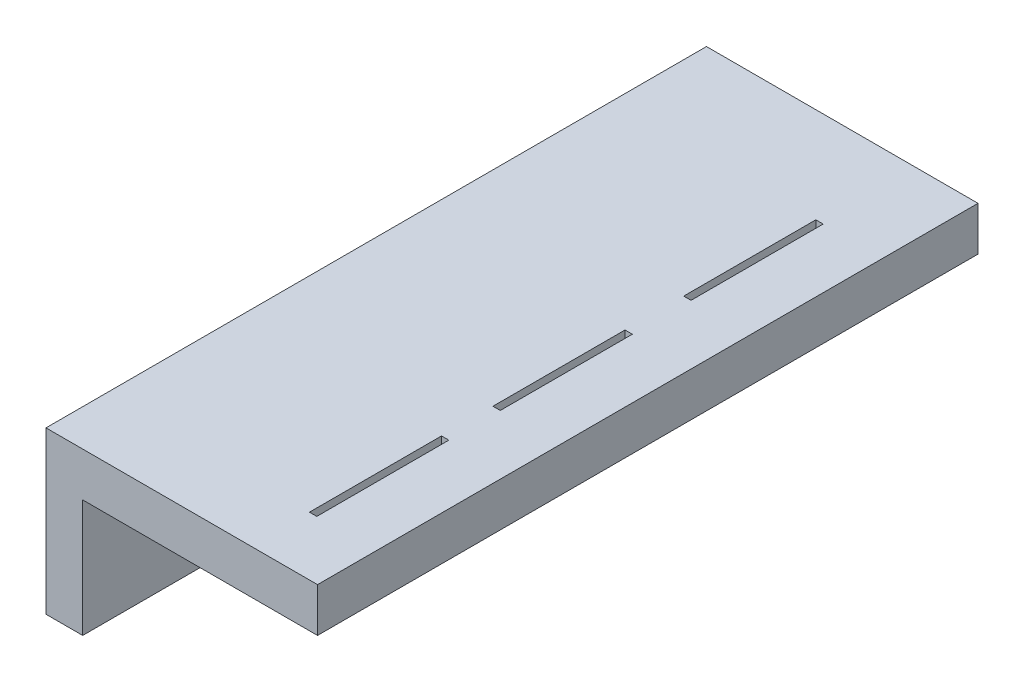
ISO-10303-21;
HEADER;
FILE_DESCRIPTION(('STEP AP214'),'2;1');
FILE_NAME('part.step','',(''),(''),'','','');
FILE_SCHEMA(('AUTOMOTIVE_DESIGN { 1 0 10303 214 1 1 1 1 }'));
ENDSEC;
DATA;
#1=APPLICATION_CONTEXT('core data for automotive mechanical design processes');
#2=APPLICATION_PROTOCOL_DEFINITION('international standard','automotive_design',2000,#1);
#3=PRODUCT_CONTEXT('',#1,'mechanical');
#4=PRODUCT('Part','Part','',(#3));
#5=PRODUCT_RELATED_PRODUCT_CATEGORY('part','',(#4));
#6=PRODUCT_DEFINITION_FORMATION('','',#4);
#7=PRODUCT_DEFINITION_CONTEXT('part definition',#1,'design');
#8=PRODUCT_DEFINITION('design','',#6,#7);
#9=PRODUCT_DEFINITION_SHAPE('','',#8);
#10=(LENGTH_UNIT() NAMED_UNIT(*) SI_UNIT(.MILLI.,.METRE.));
#11=(NAMED_UNIT(*) PLANE_ANGLE_UNIT() SI_UNIT($,.RADIAN.));
#12=(NAMED_UNIT(*) SI_UNIT($,.STERADIAN.) SOLID_ANGLE_UNIT());
#13=UNCERTAINTY_MEASURE_WITH_UNIT(LENGTH_MEASURE(1.E-05),#10,'distance_accuracy_value','');
#14=(GEOMETRIC_REPRESENTATION_CONTEXT(3) GLOBAL_UNCERTAINTY_ASSIGNED_CONTEXT((#13)) GLOBAL_UNIT_ASSIGNED_CONTEXT((#10,
#11,#12)) REPRESENTATION_CONTEXT('',''));
#15=CARTESIAN_POINT('',(0.,0.,0.));
#16=DIRECTION('',(0.,0.,1.));
#17=DIRECTION('',(1.,0.,0.));
#18=AXIS2_PLACEMENT_3D('',#15,#16,#17);
#19=CARTESIAN_POINT('',(0.,30.,0.));
#20=DIRECTION('',(0.,1.,0.));
#21=DIRECTION('',(0.,0.,1.));
#22=AXIS2_PLACEMENT_3D('',#19,#20,#21);
#23=PLANE('',#22);
#24=DIRECTION('',(-1.,0.,0.));
#25=VECTOR('',#24,1.);
#26=CARTESIAN_POINT('',(11.45,30.,-30.));
#27=LINE('',#26,#25);
#28=CARTESIAN_POINT('',(11.95,30.,-30.));
#29=VERTEX_POINT('',#28);
#30=CARTESIAN_POINT('',(11.45,30.,-30.));
#31=VERTEX_POINT('',#30);
#32=EDGE_CURVE('E231',#29,#31,#27,.T.);
#33=ORIENTED_EDGE('',*,*,#32,.T.);
#34=DIRECTION('',(0.,0.,1.));
#35=VECTOR('',#34,1.);
#36=CARTESIAN_POINT('',(11.45,30.,-30.));
#37=LINE('',#36,#35);
#38=CARTESIAN_POINT('',(11.45,30.,-21.));
#39=VERTEX_POINT('',#38);
#40=EDGE_CURVE('E221',#31,#39,#37,.T.);
#41=ORIENTED_EDGE('',*,*,#40,.T.);
#42=DIRECTION('',(1.,0.,0.));
#43=VECTOR('',#42,1.);
#44=CARTESIAN_POINT('',(11.45,30.,-21.));
#45=LINE('',#44,#43);
#46=CARTESIAN_POINT('',(11.95,30.,-21.));
#47=VERTEX_POINT('',#46);
#48=EDGE_CURVE('E224',#39,#47,#45,.T.);
#49=ORIENTED_EDGE('',*,*,#48,.T.);
#50=DIRECTION('',(0.,0.,-1.));
#51=VECTOR('',#50,1.);
#52=CARTESIAN_POINT('',(11.95,30.,-30.));
#53=LINE('',#52,#51);
#54=EDGE_CURVE('E228',#47,#29,#53,.T.);
#55=ORIENTED_EDGE('',*,*,#54,.T.);
#56=EDGE_LOOP('',(#33,#41,#49,#55));
#57=FACE_BOUND('',#56,.T.);
#58=DIRECTION('',(-1.,0.,0.));
#59=VECTOR('',#58,1.);
#60=CARTESIAN_POINT('',(11.45,30.,-42.5));
#61=LINE('',#60,#59);
#62=CARTESIAN_POINT('',(11.95,30.,-42.5));
#63=VERTEX_POINT('',#62);
#64=CARTESIAN_POINT('',(11.45,30.,-42.5));
#65=VERTEX_POINT('',#64);
#66=EDGE_CURVE('E263',#63,#65,#61,.T.);
#67=ORIENTED_EDGE('',*,*,#66,.T.);
#68=DIRECTION('',(0.,0.,1.));
#69=VECTOR('',#68,1.);
#70=CARTESIAN_POINT('',(11.45,30.,-42.5));
#71=LINE('',#70,#69);
#72=CARTESIAN_POINT('',(11.45,30.,-33.5));
#73=VERTEX_POINT('',#72);
#74=EDGE_CURVE('E253',#65,#73,#71,.T.);
#75=ORIENTED_EDGE('',*,*,#74,.T.);
#76=DIRECTION('',(1.,0.,0.));
#77=VECTOR('',#76,1.);
#78=CARTESIAN_POINT('',(11.45,30.,-33.5));
#79=LINE('',#78,#77);
#80=CARTESIAN_POINT('',(11.95,30.,-33.5));
#81=VERTEX_POINT('',#80);
#82=EDGE_CURVE('E256',#73,#81,#79,.T.);
#83=ORIENTED_EDGE('',*,*,#82,.T.);
#84=DIRECTION('',(0.,0.,-1.));
#85=VECTOR('',#84,1.);
#86=CARTESIAN_POINT('',(11.95,30.,-42.5));
#87=LINE('',#86,#85);
#88=EDGE_CURVE('E260',#81,#63,#87,.T.);
#89=ORIENTED_EDGE('',*,*,#88,.T.);
#90=EDGE_LOOP('',(#67,#75,#83,#89));
#91=FACE_BOUND('',#90,.T.);
#92=DIRECTION('',(-1.,0.,0.));
#93=VECTOR('',#92,1.);
#94=CARTESIAN_POINT('',(11.45,30.,-55.5));
#95=LINE('',#94,#93);
#96=CARTESIAN_POINT('',(11.95,30.,-55.5));
#97=VERTEX_POINT('',#96);
#98=CARTESIAN_POINT('',(11.45,30.,-55.5));
#99=VERTEX_POINT('',#98);
#100=EDGE_CURVE('E295',#97,#99,#95,.T.);
#101=ORIENTED_EDGE('',*,*,#100,.T.);
#102=DIRECTION('',(0.,0.,1.));
#103=VECTOR('',#102,1.);
#104=CARTESIAN_POINT('',(11.45,30.,-55.5));
#105=LINE('',#104,#103);
#106=CARTESIAN_POINT('',(11.45,30.,-46.5));
#107=VERTEX_POINT('',#106);
#108=EDGE_CURVE('E285',#99,#107,#105,.T.);
#109=ORIENTED_EDGE('',*,*,#108,.T.);
#110=DIRECTION('',(1.,0.,0.));
#111=VECTOR('',#110,1.);
#112=CARTESIAN_POINT('',(11.45,30.,-46.5));
#113=LINE('',#112,#111);
#114=CARTESIAN_POINT('',(11.95,30.,-46.5));
#115=VERTEX_POINT('',#114);
#116=EDGE_CURVE('E288',#107,#115,#113,.T.);
#117=ORIENTED_EDGE('',*,*,#116,.T.);
#118=DIRECTION('',(0.,0.,-1.));
#119=VECTOR('',#118,1.);
#120=CARTESIAN_POINT('',(11.95,30.,-55.5));
#121=LINE('',#120,#119);
#122=EDGE_CURVE('E292',#115,#97,#121,.T.);
#123=ORIENTED_EDGE('',*,*,#122,.T.);
#124=EDGE_LOOP('',(#101,#109,#117,#123));
#125=FACE_BOUND('',#124,.T.);
#126=DIRECTION('',(0.,0.,1.));
#127=VECTOR('',#126,1.);
#128=CARTESIAN_POINT('',(0.,30.,-17.));
#129=LINE('',#128,#127);
#130=CARTESIAN_POINT('',(0.,30.,-62.));
#131=VERTEX_POINT('',#130);
#132=CARTESIAN_POINT('',(0.,30.,-17.));
#133=VERTEX_POINT('',#132);
#134=EDGE_CURVE('E54',#131,#133,#129,.T.);
#135=ORIENTED_EDGE('',*,*,#134,.F.);
#136=DIRECTION('',(-1.,0.,0.));
#137=VECTOR('',#136,1.);
#138=CARTESIAN_POINT('',(70.4,30.,-62.));
#139=LINE('',#138,#137);
#140=CARTESIAN_POINT('',(16.,30.,-62.));
#141=VERTEX_POINT('',#140);
#142=EDGE_CURVE('E317',#141,#131,#139,.T.);
#143=ORIENTED_EDGE('',*,*,#142,.F.);
#144=DIRECTION('',(0.,0.,1.));
#145=VECTOR('',#144,1.);
#146=CARTESIAN_POINT('',(16.,30.,-62.));
#147=LINE('',#146,#145);
#148=CARTESIAN_POINT('',(16.,30.,-17.));
#149=VERTEX_POINT('',#148);
#150=EDGE_CURVE('E212',#141,#149,#147,.T.);
#151=ORIENTED_EDGE('',*,*,#150,.T.);
#152=DIRECTION('',(1.,0.,0.));
#153=VECTOR('',#152,1.);
#154=CARTESIAN_POINT('',(0.,30.,-17.));
#155=LINE('',#154,#153);
#156=EDGE_CURVE('E204',#133,#149,#155,.T.);
#157=ORIENTED_EDGE('',*,*,#156,.F.);
#158=EDGE_LOOP('',(#135,#143,#151,#157));
#159=FACE_BOUND('',#158,.T.);
#160=ADVANCED_FACE('F37',(#57,#91,#125,#159),#23,.F.);
#161=CARTESIAN_POINT('',(0.,0.,-62.));
#162=DIRECTION('',(0.,0.,-1.));
#163=DIRECTION('',(-1.,0.,0.));
#164=AXIS2_PLACEMENT_3D('',#161,#162,#163);
#165=PLANE('',#164);
#166=ORIENTED_EDGE('',*,*,#142,.T.);
#167=DIRECTION('',(0.,1.,0.));
#168=VECTOR('',#167,1.);
#169=CARTESIAN_POINT('',(0.,22.,-62.));
#170=LINE('',#169,#168);
#171=CARTESIAN_POINT('',(0.,22.,-62.));
#172=VERTEX_POINT('',#171);
#173=EDGE_CURVE('E180',#172,#131,#170,.T.);
#174=ORIENTED_EDGE('',*,*,#173,.F.);
#175=DIRECTION('',(1.,0.,0.));
#176=VECTOR('',#175,1.);
#177=CARTESIAN_POINT('',(-2.5,22.,-62.));
#178=LINE('',#177,#176);
#179=CARTESIAN_POINT('',(-2.5,22.,-62.));
#180=VERTEX_POINT('',#179);
#181=EDGE_CURVE('E178',#180,#172,#178,.T.);
#182=ORIENTED_EDGE('',*,*,#181,.F.);
#183=DIRECTION('',(0.,-1.,0.));
#184=VECTOR('',#183,1.);
#185=CARTESIAN_POINT('',(-2.5,33.,-62.));
#186=LINE('',#185,#184);
#187=CARTESIAN_POINT('',(-2.5,33.,-62.));
#188=VERTEX_POINT('',#187);
#189=EDGE_CURVE('E165',#188,#180,#186,.T.);
#190=ORIENTED_EDGE('',*,*,#189,.F.);
#191=DIRECTION('',(-1.,0.,0.));
#192=VECTOR('',#191,1.);
#193=CARTESIAN_POINT('',(70.4,33.,-62.));
#194=LINE('',#193,#192);
#195=CARTESIAN_POINT('',(16.,33.,-62.));
#196=VERTEX_POINT('',#195);
#197=EDGE_CURVE('E11',#196,#188,#194,.T.);
#198=ORIENTED_EDGE('',*,*,#197,.F.);
#199=DIRECTION('',(0.,1.,0.));
#200=VECTOR('',#199,1.);
#201=CARTESIAN_POINT('',(16.,30.,-62.));
#202=LINE('',#201,#200);
#203=EDGE_CURVE('E62',#141,#196,#202,.T.);
#204=ORIENTED_EDGE('',*,*,#203,.F.);
#205=EDGE_LOOP('',(#166,#174,#182,#190,#198,#204));
#206=FACE_BOUND('',#205,.T.);
#207=ADVANCED_FACE('F39',(#206),#165,.T.);
#208=CARTESIAN_POINT('',(0.,30.,-17.));
#209=DIRECTION('',(0.,0.,-1.));
#210=DIRECTION('',(-1.,0.,0.));
#211=AXIS2_PLACEMENT_3D('',#208,#209,#210);
#212=PLANE('',#211);
#213=DIRECTION('',(1.,0.,0.));
#214=VECTOR('',#213,1.);
#215=CARTESIAN_POINT('',(0.,33.,-17.));
#216=LINE('',#215,#214);
#217=CARTESIAN_POINT('',(-2.5,33.,-17.));
#218=VERTEX_POINT('',#217);
#219=CARTESIAN_POINT('',(16.,33.,-17.));
#220=VERTEX_POINT('',#219);
#221=EDGE_CURVE('E46',#218,#220,#216,.T.);
#222=ORIENTED_EDGE('',*,*,#221,.F.);
#223=DIRECTION('',(0.,1.,0.));
#224=VECTOR('',#223,1.);
#225=CARTESIAN_POINT('',(-2.5,33.,-17.));
#226=LINE('',#225,#224);
#227=CARTESIAN_POINT('',(-2.5,22.,-17.));
#228=VERTEX_POINT('',#227);
#229=EDGE_CURVE('E200',#228,#218,#226,.T.);
#230=ORIENTED_EDGE('',*,*,#229,.F.);
#231=DIRECTION('',(-1.,0.,0.));
#232=VECTOR('',#231,1.);
#233=CARTESIAN_POINT('',(-2.5,22.,-17.));
#234=LINE('',#233,#232);
#235=CARTESIAN_POINT('',(0.,22.,-17.));
#236=VERTEX_POINT('',#235);
#237=EDGE_CURVE('E188',#236,#228,#234,.T.);
#238=ORIENTED_EDGE('',*,*,#237,.F.);
#239=DIRECTION('',(0.,1.,0.));
#240=VECTOR('',#239,1.);
#241=CARTESIAN_POINT('',(0.,22.,-17.));
#242=LINE('',#241,#240);
#243=EDGE_CURVE('E197',#236,#133,#242,.T.);
#244=ORIENTED_EDGE('',*,*,#243,.T.);
#245=ORIENTED_EDGE('',*,*,#156,.T.);
#246=DIRECTION('',(0.,1.,0.));
#247=VECTOR('',#246,1.);
#248=CARTESIAN_POINT('',(16.,30.,-17.));
#249=LINE('',#248,#247);
#250=EDGE_CURVE('E215',#149,#220,#249,.T.);
#251=ORIENTED_EDGE('',*,*,#250,.T.);
#252=EDGE_LOOP('',(#222,#230,#238,#244,#245,#251));
#253=FACE_BOUND('',#252,.T.);
#254=ADVANCED_FACE('F323',(#253),#212,.F.);
#255=CARTESIAN_POINT('',(0.,33.,0.));
#256=DIRECTION('',(0.,1.,0.));
#257=DIRECTION('',(0.,0.,1.));
#258=AXIS2_PLACEMENT_3D('',#255,#256,#257);
#259=PLANE('',#258);
#260=DIRECTION('',(0.,0.,1.));
#261=VECTOR('',#260,1.);
#262=CARTESIAN_POINT('',(16.,33.,-62.));
#263=LINE('',#262,#261);
#264=EDGE_CURVE('E175',#196,#220,#263,.T.);
#265=ORIENTED_EDGE('',*,*,#264,.F.);
#266=ORIENTED_EDGE('',*,*,#197,.T.);
#267=DIRECTION('',(0.,0.,-1.));
#268=VECTOR('',#267,1.);
#269=CARTESIAN_POINT('',(-2.5,33.,-17.));
#270=LINE('',#269,#268);
#271=EDGE_CURVE('E172',#218,#188,#270,.T.);
#272=ORIENTED_EDGE('',*,*,#271,.F.);
#273=ORIENTED_EDGE('',*,*,#221,.T.);
#274=EDGE_LOOP('',(#265,#266,#272,#273));
#275=FACE_BOUND('',#274,.T.);
#276=DIRECTION('',(0.,0.,1.));
#277=VECTOR('',#276,1.);
#278=CARTESIAN_POINT('',(11.45,33.,-55.5));
#279=LINE('',#278,#277);
#280=CARTESIAN_POINT('',(11.45,33.,-55.5));
#281=VERTEX_POINT('',#280);
#282=CARTESIAN_POINT('',(11.45,33.,-46.5));
#283=VERTEX_POINT('',#282);
#284=EDGE_CURVE('E278',#281,#283,#279,.T.);
#285=ORIENTED_EDGE('',*,*,#284,.F.);
#286=DIRECTION('',(-1.,0.,0.));
#287=VECTOR('',#286,1.);
#288=CARTESIAN_POINT('',(11.45,33.,-55.5));
#289=LINE('',#288,#287);
#290=CARTESIAN_POINT('',(11.95,33.,-55.5));
#291=VERTEX_POINT('',#290);
#292=EDGE_CURVE('E289',#291,#281,#289,.T.);
#293=ORIENTED_EDGE('',*,*,#292,.F.);
#294=DIRECTION('',(0.,0.,-1.));
#295=VECTOR('',#294,1.);
#296=CARTESIAN_POINT('',(11.95,33.,-55.5));
#297=LINE('',#296,#295);
#298=CARTESIAN_POINT('',(11.95,33.,-46.5));
#299=VERTEX_POINT('',#298);
#300=EDGE_CURVE('E303',#299,#291,#297,.T.);
#301=ORIENTED_EDGE('',*,*,#300,.F.);
#302=DIRECTION('',(1.,0.,0.));
#303=VECTOR('',#302,1.);
#304=CARTESIAN_POINT('',(11.45,33.,-46.5));
#305=LINE('',#304,#303);
#306=EDGE_CURVE('E300',#283,#299,#305,.T.);
#307=ORIENTED_EDGE('',*,*,#306,.F.);
#308=EDGE_LOOP('',(#285,#293,#301,#307));
#309=FACE_BOUND('',#308,.T.);
#310=DIRECTION('',(0.,0.,1.));
#311=VECTOR('',#310,1.);
#312=CARTESIAN_POINT('',(11.45,33.,-42.5));
#313=LINE('',#312,#311);
#314=CARTESIAN_POINT('',(11.45,33.,-42.5));
#315=VERTEX_POINT('',#314);
#316=CARTESIAN_POINT('',(11.45,33.,-33.5));
#317=VERTEX_POINT('',#316);
#318=EDGE_CURVE('E246',#315,#317,#313,.T.);
#319=ORIENTED_EDGE('',*,*,#318,.F.);
#320=DIRECTION('',(-1.,0.,0.));
#321=VECTOR('',#320,1.);
#322=CARTESIAN_POINT('',(11.45,33.,-42.5));
#323=LINE('',#322,#321);
#324=CARTESIAN_POINT('',(11.95,33.,-42.5));
#325=VERTEX_POINT('',#324);
#326=EDGE_CURVE('E257',#325,#315,#323,.T.);
#327=ORIENTED_EDGE('',*,*,#326,.F.);
#328=DIRECTION('',(0.,0.,-1.));
#329=VECTOR('',#328,1.);
#330=CARTESIAN_POINT('',(11.95,33.,-42.5));
#331=LINE('',#330,#329);
#332=CARTESIAN_POINT('',(11.95,33.,-33.5));
#333=VERTEX_POINT('',#332);
#334=EDGE_CURVE('E271',#333,#325,#331,.T.);
#335=ORIENTED_EDGE('',*,*,#334,.F.);
#336=DIRECTION('',(1.,0.,0.));
#337=VECTOR('',#336,1.);
#338=CARTESIAN_POINT('',(11.45,33.,-33.5));
#339=LINE('',#338,#337);
#340=EDGE_CURVE('E268',#317,#333,#339,.T.);
#341=ORIENTED_EDGE('',*,*,#340,.F.);
#342=EDGE_LOOP('',(#319,#327,#335,#341));
#343=FACE_BOUND('',#342,.T.);
#344=DIRECTION('',(0.,0.,1.));
#345=VECTOR('',#344,1.);
#346=CARTESIAN_POINT('',(11.45,33.,-30.));
#347=LINE('',#346,#345);
#348=CARTESIAN_POINT('',(11.45,33.,-30.));
#349=VERTEX_POINT('',#348);
#350=CARTESIAN_POINT('',(11.45,33.,-21.));
#351=VERTEX_POINT('',#350);
#352=EDGE_CURVE('E218',#349,#351,#347,.T.);
#353=ORIENTED_EDGE('',*,*,#352,.F.);
#354=DIRECTION('',(-1.,0.,0.));
#355=VECTOR('',#354,1.);
#356=CARTESIAN_POINT('',(11.45,33.,-30.));
#357=LINE('',#356,#355);
#358=CARTESIAN_POINT('',(11.95,33.,-30.));
#359=VERTEX_POINT('',#358);
#360=EDGE_CURVE('E225',#359,#349,#357,.T.);
#361=ORIENTED_EDGE('',*,*,#360,.F.);
#362=DIRECTION('',(0.,0.,-1.));
#363=VECTOR('',#362,1.);
#364=CARTESIAN_POINT('',(11.95,33.,-30.));
#365=LINE('',#364,#363);
#366=CARTESIAN_POINT('',(11.95,33.,-21.));
#367=VERTEX_POINT('',#366);
#368=EDGE_CURVE('E239',#367,#359,#365,.T.);
#369=ORIENTED_EDGE('',*,*,#368,.F.);
#370=DIRECTION('',(1.,0.,0.));
#371=VECTOR('',#370,1.);
#372=CARTESIAN_POINT('',(11.45,33.,-21.));
#373=LINE('',#372,#371);
#374=EDGE_CURVE('E236',#351,#367,#373,.T.);
#375=ORIENTED_EDGE('',*,*,#374,.F.);
#376=EDGE_LOOP('',(#353,#361,#369,#375));
#377=FACE_BOUND('',#376,.T.);
#378=ADVANCED_FACE('F334',(#275,#309,#343,#377),#259,.T.);
#379=CARTESIAN_POINT('',(11.45,30.,-55.5));
#380=DIRECTION('',(-1.,0.,0.));
#381=DIRECTION('',(0.,0.,1.));
#382=AXIS2_PLACEMENT_3D('',#379,#380,#381);
#383=PLANE('',#382);
#384=ORIENTED_EDGE('',*,*,#284,.T.);
#385=DIRECTION('',(0.,1.,0.));
#386=VECTOR('',#385,1.);
#387=CARTESIAN_POINT('',(11.45,30.,-46.5));
#388=LINE('',#387,#386);
#389=EDGE_CURVE('E298',#107,#283,#388,.T.);
#390=ORIENTED_EDGE('',*,*,#389,.F.);
#391=ORIENTED_EDGE('',*,*,#108,.F.);
#392=DIRECTION('',(0.,1.,0.));
#393=VECTOR('',#392,1.);
#394=CARTESIAN_POINT('',(11.45,30.,-55.5));
#395=LINE('',#394,#393);
#396=EDGE_CURVE('E308',#99,#281,#395,.T.);
#397=ORIENTED_EDGE('',*,*,#396,.T.);
#398=EDGE_LOOP('',(#384,#390,#391,#397));
#399=FACE_BOUND('',#398,.T.);
#400=ADVANCED_FACE('F340',(#399),#383,.F.);
#401=CARTESIAN_POINT('',(11.45,30.,-55.5));
#402=DIRECTION('',(0.,0.,-1.));
#403=DIRECTION('',(-1.,0.,0.));
#404=AXIS2_PLACEMENT_3D('',#401,#402,#403);
#405=PLANE('',#404);
#406=ORIENTED_EDGE('',*,*,#292,.T.);
#407=ORIENTED_EDGE('',*,*,#396,.F.);
#408=ORIENTED_EDGE('',*,*,#100,.F.);
#409=DIRECTION('',(0.,1.,0.));
#410=VECTOR('',#409,1.);
#411=CARTESIAN_POINT('',(11.95,30.,-55.5));
#412=LINE('',#411,#410);
#413=EDGE_CURVE('E310',#97,#291,#412,.T.);
#414=ORIENTED_EDGE('',*,*,#413,.T.);
#415=EDGE_LOOP('',(#406,#407,#408,#414));
#416=FACE_BOUND('',#415,.T.);
#417=ADVANCED_FACE('F345',(#416),#405,.F.);
#418=CARTESIAN_POINT('',(11.95,30.,-55.5));
#419=DIRECTION('',(1.,0.,0.));
#420=DIRECTION('',(0.,0.,-1.));
#421=AXIS2_PLACEMENT_3D('',#418,#419,#420);
#422=PLANE('',#421);
#423=ORIENTED_EDGE('',*,*,#300,.T.);
#424=ORIENTED_EDGE('',*,*,#413,.F.);
#425=ORIENTED_EDGE('',*,*,#122,.F.);
#426=DIRECTION('',(0.,1.,0.));
#427=VECTOR('',#426,1.);
#428=CARTESIAN_POINT('',(11.95,30.,-46.5));
#429=LINE('',#428,#427);
#430=EDGE_CURVE('E312',#115,#299,#429,.T.);
#431=ORIENTED_EDGE('',*,*,#430,.T.);
#432=EDGE_LOOP('',(#423,#424,#425,#431));
#433=FACE_BOUND('',#432,.T.);
#434=ADVANCED_FACE('F403',(#433),#422,.F.);
#435=CARTESIAN_POINT('',(11.45,30.,-46.5));
#436=DIRECTION('',(0.,0.,1.));
#437=DIRECTION('',(1.,0.,0.));
#438=AXIS2_PLACEMENT_3D('',#435,#436,#437);
#439=PLANE('',#438);
#440=ORIENTED_EDGE('',*,*,#306,.T.);
#441=ORIENTED_EDGE('',*,*,#430,.F.);
#442=ORIENTED_EDGE('',*,*,#116,.F.);
#443=ORIENTED_EDGE('',*,*,#389,.T.);
#444=EDGE_LOOP('',(#440,#441,#442,#443));
#445=FACE_BOUND('',#444,.T.);
#446=ADVANCED_FACE('F399',(#445),#439,.F.);
#447=CARTESIAN_POINT('',(11.45,30.,-42.5));
#448=DIRECTION('',(-1.,0.,0.));
#449=DIRECTION('',(0.,0.,1.));
#450=AXIS2_PLACEMENT_3D('',#447,#448,#449);
#451=PLANE('',#450);
#452=ORIENTED_EDGE('',*,*,#318,.T.);
#453=DIRECTION('',(0.,1.,0.));
#454=VECTOR('',#453,1.);
#455=CARTESIAN_POINT('',(11.45,30.,-33.5));
#456=LINE('',#455,#454);
#457=EDGE_CURVE('E266',#73,#317,#456,.T.);
#458=ORIENTED_EDGE('',*,*,#457,.F.);
#459=ORIENTED_EDGE('',*,*,#74,.F.);
#460=DIRECTION('',(0.,1.,0.));
#461=VECTOR('',#460,1.);
#462=CARTESIAN_POINT('',(11.45,30.,-42.5));
#463=LINE('',#462,#461);
#464=EDGE_CURVE('E276',#65,#315,#463,.T.);
#465=ORIENTED_EDGE('',*,*,#464,.T.);
#466=EDGE_LOOP('',(#452,#458,#459,#465));
#467=FACE_BOUND('',#466,.T.);
#468=ADVANCED_FACE('F389',(#467),#451,.F.);
#469=CARTESIAN_POINT('',(11.45,30.,-42.5));
#470=DIRECTION('',(0.,0.,-1.));
#471=DIRECTION('',(-1.,0.,0.));
#472=AXIS2_PLACEMENT_3D('',#469,#470,#471);
#473=PLANE('',#472);
#474=ORIENTED_EDGE('',*,*,#326,.T.);
#475=ORIENTED_EDGE('',*,*,#464,.F.);
#476=ORIENTED_EDGE('',*,*,#66,.F.);
#477=DIRECTION('',(0.,1.,0.));
#478=VECTOR('',#477,1.);
#479=CARTESIAN_POINT('',(11.95,30.,-42.5));
#480=LINE('',#479,#478);
#481=EDGE_CURVE('E279',#63,#325,#480,.T.);
#482=ORIENTED_EDGE('',*,*,#481,.T.);
#483=EDGE_LOOP('',(#474,#475,#476,#482));
#484=FACE_BOUND('',#483,.T.);
#485=ADVANCED_FACE('F385',(#484),#473,.F.);
#486=CARTESIAN_POINT('',(11.95,30.,-42.5));
#487=DIRECTION('',(1.,0.,0.));
#488=DIRECTION('',(0.,0.,-1.));
#489=AXIS2_PLACEMENT_3D('',#486,#487,#488);
#490=PLANE('',#489);
#491=ORIENTED_EDGE('',*,*,#334,.T.);
#492=ORIENTED_EDGE('',*,*,#481,.F.);
#493=ORIENTED_EDGE('',*,*,#88,.F.);
#494=DIRECTION('',(0.,1.,0.));
#495=VECTOR('',#494,1.);
#496=CARTESIAN_POINT('',(11.95,30.,-33.5));
#497=LINE('',#496,#495);
#498=EDGE_CURVE('E281',#81,#333,#497,.T.);
#499=ORIENTED_EDGE('',*,*,#498,.T.);
#500=EDGE_LOOP('',(#491,#492,#493,#499));
#501=FACE_BOUND('',#500,.T.);
#502=ADVANCED_FACE('F388',(#501),#490,.F.);
#503=CARTESIAN_POINT('',(11.45,30.,-33.5));
#504=DIRECTION('',(0.,0.,1.));
#505=DIRECTION('',(1.,0.,0.));
#506=AXIS2_PLACEMENT_3D('',#503,#504,#505);
#507=PLANE('',#506);
#508=ORIENTED_EDGE('',*,*,#340,.T.);
#509=ORIENTED_EDGE('',*,*,#498,.F.);
#510=ORIENTED_EDGE('',*,*,#82,.F.);
#511=ORIENTED_EDGE('',*,*,#457,.T.);
#512=EDGE_LOOP('',(#508,#509,#510,#511));
#513=FACE_BOUND('',#512,.T.);
#514=ADVANCED_FACE('F384',(#513),#507,.F.);
#515=CARTESIAN_POINT('',(11.45,30.,-30.));
#516=DIRECTION('',(-1.,0.,0.));
#517=DIRECTION('',(0.,0.,1.));
#518=AXIS2_PLACEMENT_3D('',#515,#516,#517);
#519=PLANE('',#518);
#520=ORIENTED_EDGE('',*,*,#352,.T.);
#521=DIRECTION('',(0.,1.,0.));
#522=VECTOR('',#521,1.);
#523=CARTESIAN_POINT('',(11.45,30.,-21.));
#524=LINE('',#523,#522);
#525=EDGE_CURVE('E234',#39,#351,#524,.T.);
#526=ORIENTED_EDGE('',*,*,#525,.F.);
#527=ORIENTED_EDGE('',*,*,#40,.F.);
#528=DIRECTION('',(0.,1.,0.));
#529=VECTOR('',#528,1.);
#530=CARTESIAN_POINT('',(11.45,30.,-30.));
#531=LINE('',#530,#529);
#532=EDGE_CURVE('E244',#31,#349,#531,.T.);
#533=ORIENTED_EDGE('',*,*,#532,.T.);
#534=EDGE_LOOP('',(#520,#526,#527,#533));
#535=FACE_BOUND('',#534,.T.);
#536=ADVANCED_FACE('F361',(#535),#519,.F.);
#537=CARTESIAN_POINT('',(11.45,30.,-30.));
#538=DIRECTION('',(0.,0.,-1.));
#539=DIRECTION('',(-1.,0.,0.));
#540=AXIS2_PLACEMENT_3D('',#537,#538,#539);
#541=PLANE('',#540);
#542=ORIENTED_EDGE('',*,*,#360,.T.);
#543=ORIENTED_EDGE('',*,*,#532,.F.);
#544=ORIENTED_EDGE('',*,*,#32,.F.);
#545=DIRECTION('',(0.,1.,0.));
#546=VECTOR('',#545,1.);
#547=CARTESIAN_POINT('',(11.95,30.,-30.));
#548=LINE('',#547,#546);
#549=EDGE_CURVE('E247',#29,#359,#548,.T.);
#550=ORIENTED_EDGE('',*,*,#549,.T.);
#551=EDGE_LOOP('',(#542,#543,#544,#550));
#552=FACE_BOUND('',#551,.T.);
#553=ADVANCED_FACE('F369',(#552),#541,.F.);
#554=CARTESIAN_POINT('',(11.95,30.,-30.));
#555=DIRECTION('',(1.,0.,0.));
#556=DIRECTION('',(0.,0.,-1.));
#557=AXIS2_PLACEMENT_3D('',#554,#555,#556);
#558=PLANE('',#557);
#559=ORIENTED_EDGE('',*,*,#368,.T.);
#560=ORIENTED_EDGE('',*,*,#549,.F.);
#561=ORIENTED_EDGE('',*,*,#54,.F.);
#562=DIRECTION('',(0.,1.,0.));
#563=VECTOR('',#562,1.);
#564=CARTESIAN_POINT('',(11.95,30.,-21.));
#565=LINE('',#564,#563);
#566=EDGE_CURVE('E249',#47,#367,#565,.T.);
#567=ORIENTED_EDGE('',*,*,#566,.T.);
#568=EDGE_LOOP('',(#559,#560,#561,#567));
#569=FACE_BOUND('',#568,.T.);
#570=ADVANCED_FACE('F371',(#569),#558,.F.);
#571=CARTESIAN_POINT('',(11.45,30.,-21.));
#572=DIRECTION('',(0.,0.,1.));
#573=DIRECTION('',(1.,0.,0.));
#574=AXIS2_PLACEMENT_3D('',#571,#572,#573);
#575=PLANE('',#574);
#576=ORIENTED_EDGE('',*,*,#374,.T.);
#577=ORIENTED_EDGE('',*,*,#566,.F.);
#578=ORIENTED_EDGE('',*,*,#48,.F.);
#579=ORIENTED_EDGE('',*,*,#525,.T.);
#580=EDGE_LOOP('',(#576,#577,#578,#579));
#581=FACE_BOUND('',#580,.T.);
#582=ADVANCED_FACE('F365',(#581),#575,.F.);
#583=CARTESIAN_POINT('',(16.,30.,-62.));
#584=DIRECTION('',(-1.,0.,0.));
#585=DIRECTION('',(0.,0.,1.));
#586=AXIS2_PLACEMENT_3D('',#583,#584,#585);
#587=PLANE('',#586);
#588=ORIENTED_EDGE('',*,*,#264,.T.);
#589=ORIENTED_EDGE('',*,*,#250,.F.);
#590=ORIENTED_EDGE('',*,*,#150,.F.);
#591=ORIENTED_EDGE('',*,*,#203,.T.);
#592=EDGE_LOOP('',(#588,#589,#590,#591));
#593=FACE_BOUND('',#592,.T.);
#594=ADVANCED_FACE('F325',(#593),#587,.F.);
#595=CARTESIAN_POINT('',(-2.5,0.,0.));
#596=DIRECTION('',(1.,0.,0.));
#597=DIRECTION('',(0.,0.,-1.));
#598=AXIS2_PLACEMENT_3D('',#595,#596,#597);
#599=PLANE('',#598);
#600=CARTESIAN_POINT('',(-2.5,26.,-52.));
#601=DIRECTION('',(1.,0.,0.));
#602=DIRECTION('',(0.,0.,-1.));
#603=AXIS2_PLACEMENT_3D('',#600,#601,#602);
#604=CIRCLE('',#603,1.8);
#605=CARTESIAN_POINT('',(-2.5,26.,-53.8));
#606=VERTEX_POINT('',#605);
#607=EDGE_CURVE('E538',#606,#606,#604,.T.);
#608=ORIENTED_EDGE('',*,*,#607,.T.);
#609=EDGE_LOOP('',(#608));
#610=FACE_BOUND('',#609,.T.);
#611=CARTESIAN_POINT('',(-2.5,26.,-27.));
#612=DIRECTION('',(1.,0.,0.));
#613=DIRECTION('',(0.,0.,-1.));
#614=AXIS2_PLACEMENT_3D('',#611,#612,#613);
#615=CIRCLE('',#614,1.8);
#616=CARTESIAN_POINT('',(-2.5,26.,-28.8));
#617=VERTEX_POINT('',#616);
#618=EDGE_CURVE('E190',#617,#617,#615,.T.);
#619=ORIENTED_EDGE('',*,*,#618,.T.);
#620=EDGE_LOOP('',(#619));
#621=FACE_BOUND('',#620,.T.);
#622=ORIENTED_EDGE('',*,*,#229,.T.);
#623=ORIENTED_EDGE('',*,*,#271,.T.);
#624=ORIENTED_EDGE('',*,*,#189,.T.);
#625=DIRECTION('',(0.,0.,-1.));
#626=VECTOR('',#625,1.);
#627=CARTESIAN_POINT('',(-2.5,22.,-17.));
#628=LINE('',#627,#626);
#629=EDGE_CURVE('E170',#228,#180,#628,.T.);
#630=ORIENTED_EDGE('',*,*,#629,.F.);
#631=EDGE_LOOP('',(#622,#623,#624,#630));
#632=FACE_BOUND('',#631,.T.);
#633=ADVANCED_FACE('F168',(#610,#621,#632),#599,.F.);
#634=CARTESIAN_POINT('',(0.,22.,-17.));
#635=DIRECTION('',(-1.,0.,0.));
#636=DIRECTION('',(0.,0.,1.));
#637=AXIS2_PLACEMENT_3D('',#634,#635,#636);
#638=PLANE('',#637);
#639=CARTESIAN_POINT('',(0.,26.,-52.));
#640=DIRECTION('',(1.,0.,0.));
#641=DIRECTION('',(0.,0.,-1.));
#642=AXIS2_PLACEMENT_3D('',#639,#640,#641);
#643=CIRCLE('',#642,1.8);
#644=CARTESIAN_POINT('',(0.,26.,-53.8));
#645=VERTEX_POINT('',#644);
#646=EDGE_CURVE('E535',#645,#645,#643,.T.);
#647=ORIENTED_EDGE('',*,*,#646,.F.);
#648=EDGE_LOOP('',(#647));
#649=FACE_BOUND('',#648,.T.);
#650=CARTESIAN_POINT('',(0.,26.,-27.));
#651=DIRECTION('',(1.,0.,0.));
#652=DIRECTION('',(0.,0.,-1.));
#653=AXIS2_PLACEMENT_3D('',#650,#651,#652);
#654=CIRCLE('',#653,1.8);
#655=CARTESIAN_POINT('',(0.,26.,-28.8));
#656=VERTEX_POINT('',#655);
#657=EDGE_CURVE('E539',#656,#656,#654,.T.);
#658=ORIENTED_EDGE('',*,*,#657,.F.);
#659=EDGE_LOOP('',(#658));
#660=FACE_BOUND('',#659,.T.);
#661=ORIENTED_EDGE('',*,*,#134,.T.);
#662=ORIENTED_EDGE('',*,*,#243,.F.);
#663=DIRECTION('',(0.,0.,1.));
#664=VECTOR('',#663,1.);
#665=CARTESIAN_POINT('',(0.,22.,-17.));
#666=LINE('',#665,#664);
#667=EDGE_CURVE('E183',#172,#236,#666,.T.);
#668=ORIENTED_EDGE('',*,*,#667,.F.);
#669=ORIENTED_EDGE('',*,*,#173,.T.);
#670=EDGE_LOOP('',(#661,#662,#668,#669));
#671=FACE_BOUND('',#670,.T.);
#672=ADVANCED_FACE('F497',(#649,#660,#671),#638,.F.);
#673=CARTESIAN_POINT('',(0.,22.,0.));
#674=DIRECTION('',(0.,-1.,0.));
#675=DIRECTION('',(0.,0.,-1.));
#676=AXIS2_PLACEMENT_3D('',#673,#674,#675);
#677=PLANE('',#676);
#678=ORIENTED_EDGE('',*,*,#629,.T.);
#679=ORIENTED_EDGE('',*,*,#181,.T.);
#680=ORIENTED_EDGE('',*,*,#667,.T.);
#681=ORIENTED_EDGE('',*,*,#237,.T.);
#682=EDGE_LOOP('',(#678,#679,#680,#681));
#683=FACE_BOUND('',#682,.T.);
#684=ADVANCED_FACE('F186',(#683),#677,.T.);
#685=CARTESIAN_POINT('',(-10.,26.,-27.));
#686=DIRECTION('',(1.,0.,0.));
#687=DIRECTION('',(0.,0.,-1.));
#688=AXIS2_PLACEMENT_3D('',#685,#686,#687);
#689=CYLINDRICAL_SURFACE('',#688,1.8);
#690=ORIENTED_EDGE('',*,*,#657,.T.);
#691=EDGE_LOOP('',(#690));
#692=FACE_BOUND('',#691,.T.);
#693=ORIENTED_EDGE('',*,*,#618,.F.);
#694=EDGE_LOOP('',(#693));
#695=FACE_BOUND('',#694,.T.);
#696=ADVANCED_FACE('F496',(#692,#695),#689,.F.);
#697=CARTESIAN_POINT('',(-10.,26.,-52.));
#698=DIRECTION('',(1.,0.,0.));
#699=DIRECTION('',(0.,0.,-1.));
#700=AXIS2_PLACEMENT_3D('',#697,#698,#699);
#701=CYLINDRICAL_SURFACE('',#700,1.8);
#702=ORIENTED_EDGE('',*,*,#646,.T.);
#703=EDGE_LOOP('',(#702));
#704=FACE_BOUND('',#703,.T.);
#705=ORIENTED_EDGE('',*,*,#607,.F.);
#706=EDGE_LOOP('',(#705));
#707=FACE_BOUND('',#706,.T.);
#708=ADVANCED_FACE('F518',(#704,#707),#701,.F.);
#709=CLOSED_SHELL('',(#160,#207,#254,#378,#400,#417,#434,#446,#468,#485,#502,#514,#536,#553,
#570,#582,#594,#633,#672,#684,#696,#708));
#710=MANIFOLD_SOLID_BREP('B2',#709);
#711=ADVANCED_BREP_SHAPE_REPRESENTATION('',(#18,#710),#14);
#712=SHAPE_DEFINITION_REPRESENTATION(#9,#711);
ENDSEC;
END-ISO-10303-21;
